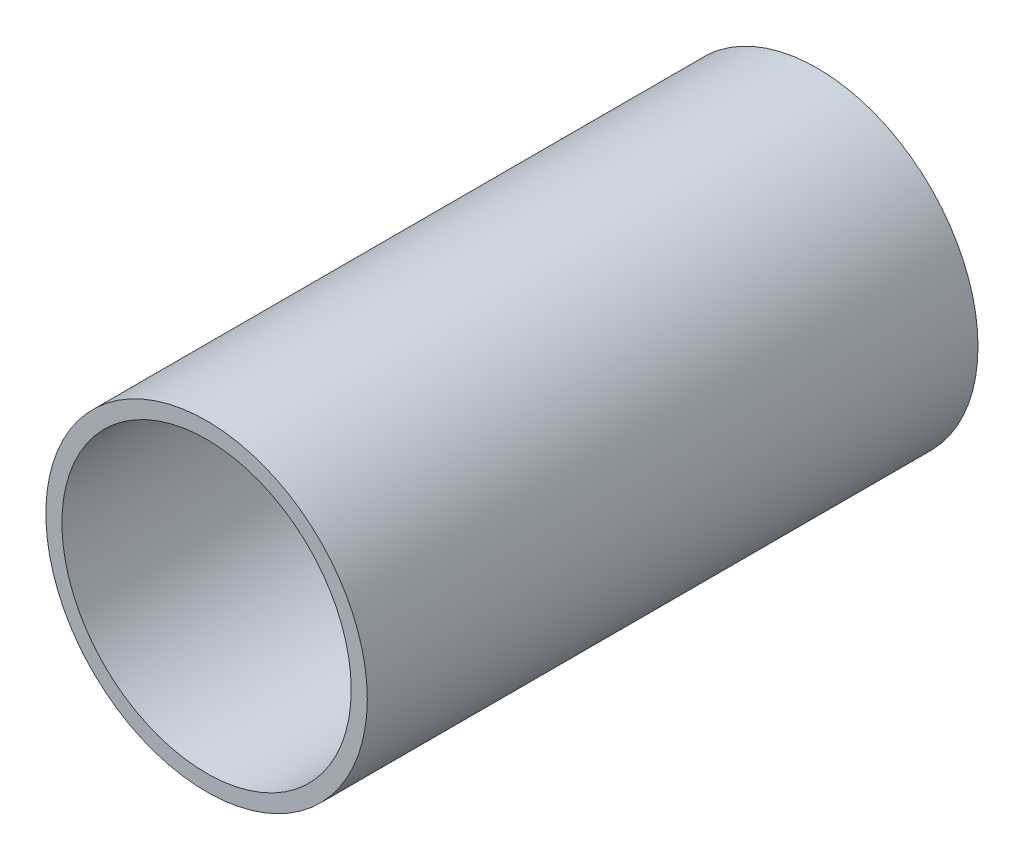
ISO-10303-21;
HEADER;
FILE_DESCRIPTION(('STEP AP214'),'2;1');
FILE_NAME('part.step','',(''),(''),'','','');
FILE_SCHEMA(('AUTOMOTIVE_DESIGN { 1 0 10303 214 1 1 1 1 }'));
ENDSEC;
DATA;
#1=APPLICATION_CONTEXT('core data for automotive mechanical design processes');
#2=APPLICATION_PROTOCOL_DEFINITION('international standard','automotive_design',2000,#1);
#3=PRODUCT_CONTEXT('',#1,'mechanical');
#4=PRODUCT('Part','Part','',(#3));
#5=PRODUCT_RELATED_PRODUCT_CATEGORY('part','',(#4));
#6=PRODUCT_DEFINITION_FORMATION('','',#4);
#7=PRODUCT_DEFINITION_CONTEXT('part definition',#1,'design');
#8=PRODUCT_DEFINITION('design','',#6,#7);
#9=PRODUCT_DEFINITION_SHAPE('','',#8);
#10=(LENGTH_UNIT() NAMED_UNIT(*) SI_UNIT(.MILLI.,.METRE.));
#11=(NAMED_UNIT(*) PLANE_ANGLE_UNIT() SI_UNIT($,.RADIAN.));
#12=(NAMED_UNIT(*) SI_UNIT($,.STERADIAN.) SOLID_ANGLE_UNIT());
#13=UNCERTAINTY_MEASURE_WITH_UNIT(LENGTH_MEASURE(1.E-05),#10,'distance_accuracy_value','');
#14=(GEOMETRIC_REPRESENTATION_CONTEXT(3) GLOBAL_UNCERTAINTY_ASSIGNED_CONTEXT((#13)) GLOBAL_UNIT_ASSIGNED_CONTEXT((#10,
#11,#12)) REPRESENTATION_CONTEXT('',''));
#15=CARTESIAN_POINT('',(0.,0.,0.));
#16=DIRECTION('',(0.,0.,1.));
#17=DIRECTION('',(1.,0.,0.));
#18=AXIS2_PLACEMENT_3D('',#15,#16,#17);
#19=CARTESIAN_POINT('',(-1.56935255802332,0.,38.));
#20=DIRECTION('',(0.,0.,1.));
#21=DIRECTION('',(1.,0.,0.));
#22=AXIS2_PLACEMENT_3D('',#19,#20,#21);
#23=PLANE('',#22);
#24=CARTESIAN_POINT('',(-1.56935255802332,0.,38.));
#25=DIRECTION('',(0.,0.,1.));
#26=DIRECTION('',(1.,0.,0.));
#27=AXIS2_PLACEMENT_3D('',#24,#25,#26);
#28=CIRCLE('',#27,10.);
#29=CARTESIAN_POINT('',(8.43064744197668,0.,38.));
#30=VERTEX_POINT('',#29);
#31=EDGE_CURVE('E10',#30,#30,#28,.T.);
#32=ORIENTED_EDGE('',*,*,#31,.T.);
#33=EDGE_LOOP('',(#32));
#34=FACE_BOUND('',#33,.T.);
#35=CARTESIAN_POINT('',(-1.56935255802332,0.,38.));
#36=DIRECTION('',(0.,0.,1.));
#37=DIRECTION('',(1.,0.,0.));
#38=AXIS2_PLACEMENT_3D('',#35,#36,#37);
#39=CIRCLE('',#38,9.);
#40=CARTESIAN_POINT('',(7.43064744197668,0.,38.));
#41=VERTEX_POINT('',#40);
#42=EDGE_CURVE('E50',#41,#41,#39,.T.);
#43=ORIENTED_EDGE('',*,*,#42,.F.);
#44=EDGE_LOOP('',(#43));
#45=FACE_BOUND('',#44,.T.);
#46=ADVANCED_FACE('F37',(#34,#45),#23,.T.);
#47=CARTESIAN_POINT('',(-1.56935255802332,0.,0.));
#48=DIRECTION('',(0.,0.,1.));
#49=DIRECTION('',(1.,0.,0.));
#50=AXIS2_PLACEMENT_3D('',#47,#48,#49);
#51=PLANE('',#50);
#52=CARTESIAN_POINT('',(-1.56935255802332,0.,0.));
#53=DIRECTION('',(0.,0.,1.));
#54=DIRECTION('',(1.,0.,0.));
#55=AXIS2_PLACEMENT_3D('',#52,#53,#54);
#56=CIRCLE('',#55,10.);
#57=CARTESIAN_POINT('',(8.43064744197668,0.,0.));
#58=VERTEX_POINT('',#57);
#59=EDGE_CURVE('E41',#58,#58,#56,.T.);
#60=ORIENTED_EDGE('',*,*,#59,.F.);
#61=EDGE_LOOP('',(#60));
#62=FACE_BOUND('',#61,.T.);
#63=CARTESIAN_POINT('',(-1.56935255802332,0.,0.));
#64=DIRECTION('',(0.,0.,1.));
#65=DIRECTION('',(1.,0.,0.));
#66=AXIS2_PLACEMENT_3D('',#63,#64,#65);
#67=CIRCLE('',#66,9.);
#68=CARTESIAN_POINT('',(7.43064744197668,0.,0.));
#69=VERTEX_POINT('',#68);
#70=EDGE_CURVE('E52',#69,#69,#67,.T.);
#71=ORIENTED_EDGE('',*,*,#70,.T.);
#72=EDGE_LOOP('',(#71));
#73=FACE_BOUND('',#72,.T.);
#74=ADVANCED_FACE('F64',(#62,#73),#51,.F.);
#75=CARTESIAN_POINT('',(-1.56935255802332,0.,38.));
#76=DIRECTION('',(0.,0.,-1.));
#77=DIRECTION('',(-1.,0.,0.));
#78=AXIS2_PLACEMENT_3D('',#75,#76,#77);
#79=CYLINDRICAL_SURFACE('',#78,10.);
#80=ORIENTED_EDGE('',*,*,#31,.F.);
#81=EDGE_LOOP('',(#80));
#82=FACE_BOUND('',#81,.T.);
#83=ORIENTED_EDGE('',*,*,#59,.T.);
#84=EDGE_LOOP('',(#83));
#85=FACE_BOUND('',#84,.T.);
#86=ADVANCED_FACE('F39',(#82,#85),#79,.T.);
#87=CARTESIAN_POINT('',(-1.56935255802332,0.,38.));
#88=DIRECTION('',(0.,0.,-1.));
#89=DIRECTION('',(-1.,0.,0.));
#90=AXIS2_PLACEMENT_3D('',#87,#88,#89);
#91=CYLINDRICAL_SURFACE('',#90,9.);
#92=ORIENTED_EDGE('',*,*,#42,.T.);
#93=EDGE_LOOP('',(#92));
#94=FACE_BOUND('',#93,.T.);
#95=ORIENTED_EDGE('',*,*,#70,.F.);
#96=EDGE_LOOP('',(#95));
#97=FACE_BOUND('',#96,.T.);
#98=ADVANCED_FACE('F60',(#94,#97),#91,.F.);
#99=CLOSED_SHELL('',(#46,#74,#86,#98));
#100=MANIFOLD_SOLID_BREP('B2',#99);
#101=ADVANCED_BREP_SHAPE_REPRESENTATION('',(#18,#100),#14);
#102=SHAPE_DEFINITION_REPRESENTATION(#9,#101);
ENDSEC;
END-ISO-10303-21;
